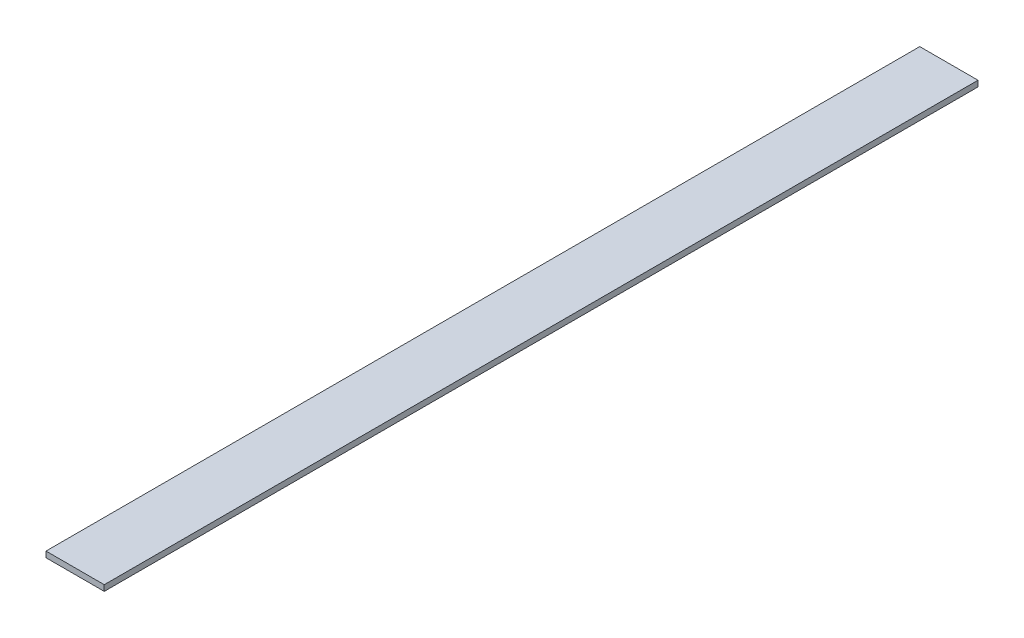
ISO-10303-21;
HEADER;
FILE_DESCRIPTION(('STEP AP214'),'2;1');
FILE_NAME('part.step','',(''),(''),'','','');
FILE_SCHEMA(('AUTOMOTIVE_DESIGN { 1 0 10303 214 1 1 1 1 }'));
ENDSEC;
DATA;
#1=APPLICATION_CONTEXT('core data for automotive mechanical design processes');
#2=APPLICATION_PROTOCOL_DEFINITION('international standard','automotive_design',2000,#1);
#3=PRODUCT_CONTEXT('',#1,'mechanical');
#4=PRODUCT('Part','Part','',(#3));
#5=PRODUCT_RELATED_PRODUCT_CATEGORY('part','',(#4));
#6=PRODUCT_DEFINITION_FORMATION('','',#4);
#7=PRODUCT_DEFINITION_CONTEXT('part definition',#1,'design');
#8=PRODUCT_DEFINITION('design','',#6,#7);
#9=PRODUCT_DEFINITION_SHAPE('','',#8);
#10=(LENGTH_UNIT() NAMED_UNIT(*) SI_UNIT(.MILLI.,.METRE.));
#11=(NAMED_UNIT(*) PLANE_ANGLE_UNIT() SI_UNIT($,.RADIAN.));
#12=(NAMED_UNIT(*) SI_UNIT($,.STERADIAN.) SOLID_ANGLE_UNIT());
#13=UNCERTAINTY_MEASURE_WITH_UNIT(LENGTH_MEASURE(1.E-05),#10,'distance_accuracy_value','');
#14=(GEOMETRIC_REPRESENTATION_CONTEXT(3) GLOBAL_UNCERTAINTY_ASSIGNED_CONTEXT((#13)) GLOBAL_UNIT_ASSIGNED_CONTEXT((#10,
#11,#12)) REPRESENTATION_CONTEXT('',''));
#15=CARTESIAN_POINT('',(0.,0.,0.));
#16=DIRECTION('',(0.,0.,1.));
#17=DIRECTION('',(1.,0.,0.));
#18=AXIS2_PLACEMENT_3D('',#15,#16,#17);
#19=CARTESIAN_POINT('',(-9.86567359338224,4.3353397151684,300.));
#20=DIRECTION('',(-1.,0.,0.));
#21=DIRECTION('',(0.,0.,1.));
#22=AXIS2_PLACEMENT_3D('',#19,#20,#21);
#23=PLANE('',#22);
#24=DIRECTION('',(0.,1.,0.));
#25=VECTOR('',#24,1.);
#26=CARTESIAN_POINT('',(-9.86567359338224,4.3353397151684,0.));
#27=LINE('',#26,#25);
#28=CARTESIAN_POINT('',(-9.86567359338224,2.3353397151684,0.));
#29=VERTEX_POINT('',#28);
#30=CARTESIAN_POINT('',(-9.86567359338224,4.3353397151684,0.));
#31=VERTEX_POINT('',#30);
#32=EDGE_CURVE('E96',#29,#31,#27,.T.);
#33=ORIENTED_EDGE('',*,*,#32,.T.);
#34=DIRECTION('',(0.,0.,-1.));
#35=VECTOR('',#34,1.);
#36=CARTESIAN_POINT('',(-9.86567359338224,4.3353397151684,300.));
#37=LINE('',#36,#35);
#38=CARTESIAN_POINT('',(-9.86567359338224,4.3353397151684,300.));
#39=VERTEX_POINT('',#38);
#40=EDGE_CURVE('E11',#39,#31,#37,.T.);
#41=ORIENTED_EDGE('',*,*,#40,.F.);
#42=DIRECTION('',(0.,1.,0.));
#43=VECTOR('',#42,1.);
#44=CARTESIAN_POINT('',(-9.86567359338224,4.3353397151684,300.));
#45=LINE('',#44,#43);
#46=CARTESIAN_POINT('',(-9.86567359338224,2.3353397151684,300.));
#47=VERTEX_POINT('',#46);
#48=EDGE_CURVE('E84',#47,#39,#45,.T.);
#49=ORIENTED_EDGE('',*,*,#48,.F.);
#50=DIRECTION('',(0.,0.,-1.));
#51=VECTOR('',#50,1.);
#52=CARTESIAN_POINT('',(-9.86567359338224,2.3353397151684,300.));
#53=LINE('',#52,#51);
#54=EDGE_CURVE('E92',#47,#29,#53,.T.);
#55=ORIENTED_EDGE('',*,*,#54,.T.);
#56=EDGE_LOOP('',(#33,#41,#49,#55));
#57=FACE_BOUND('',#56,.T.);
#58=ADVANCED_FACE('F33',(#57),#23,.F.);
#59=CARTESIAN_POINT('',(-29.8656735933822,4.3353397151684,300.));
#60=DIRECTION('',(0.,-1.,0.));
#61=DIRECTION('',(0.,0.,-1.));
#62=AXIS2_PLACEMENT_3D('',#59,#60,#61);
#63=PLANE('',#62);
#64=DIRECTION('',(-1.,0.,0.));
#65=VECTOR('',#64,1.);
#66=CARTESIAN_POINT('',(-29.8656735933822,4.3353397151684,0.));
#67=LINE('',#66,#65);
#68=CARTESIAN_POINT('',(-29.8656735933822,4.3353397151684,0.));
#69=VERTEX_POINT('',#68);
#70=EDGE_CURVE('E88',#31,#69,#67,.T.);
#71=ORIENTED_EDGE('',*,*,#70,.T.);
#72=DIRECTION('',(0.,0.,-1.));
#73=VECTOR('',#72,1.);
#74=CARTESIAN_POINT('',(-29.8656735933822,4.3353397151684,300.));
#75=LINE('',#74,#73);
#76=CARTESIAN_POINT('',(-29.8656735933822,4.3353397151684,300.));
#77=VERTEX_POINT('',#76);
#78=EDGE_CURVE('E41',#77,#69,#75,.T.);
#79=ORIENTED_EDGE('',*,*,#78,.F.);
#80=DIRECTION('',(-1.,0.,0.));
#81=VECTOR('',#80,1.);
#82=CARTESIAN_POINT('',(-29.8656735933822,4.3353397151684,300.));
#83=LINE('',#82,#81);
#84=EDGE_CURVE('E79',#39,#77,#83,.T.);
#85=ORIENTED_EDGE('',*,*,#84,.F.);
#86=ORIENTED_EDGE('',*,*,#40,.T.);
#87=EDGE_LOOP('',(#71,#79,#85,#86));
#88=FACE_BOUND('',#87,.T.);
#89=ADVANCED_FACE('F87',(#88),#63,.F.);
#90=CARTESIAN_POINT('',(-29.8656735933822,4.3353397151684,300.));
#91=DIRECTION('',(1.,0.,0.));
#92=DIRECTION('',(0.,0.,-1.));
#93=AXIS2_PLACEMENT_3D('',#90,#91,#92);
#94=PLANE('',#93);
#95=DIRECTION('',(0.,-1.,0.));
#96=VECTOR('',#95,1.);
#97=CARTESIAN_POINT('',(-29.8656735933822,4.3353397151684,0.));
#98=LINE('',#97,#96);
#99=CARTESIAN_POINT('',(-29.8656735933822,2.3353397151684,0.));
#100=VERTEX_POINT('',#99);
#101=EDGE_CURVE('E66',#69,#100,#98,.T.);
#102=ORIENTED_EDGE('',*,*,#101,.T.);
#103=DIRECTION('',(0.,0.,-1.));
#104=VECTOR('',#103,1.);
#105=CARTESIAN_POINT('',(-29.8656735933822,2.3353397151684,300.));
#106=LINE('',#105,#104);
#107=CARTESIAN_POINT('',(-29.8656735933822,2.3353397151684,300.));
#108=VERTEX_POINT('',#107);
#109=EDGE_CURVE('E89',#108,#100,#106,.T.);
#110=ORIENTED_EDGE('',*,*,#109,.F.);
#111=DIRECTION('',(0.,-1.,0.));
#112=VECTOR('',#111,1.);
#113=CARTESIAN_POINT('',(-29.8656735933822,4.3353397151684,300.));
#114=LINE('',#113,#112);
#115=EDGE_CURVE('E82',#77,#108,#114,.T.);
#116=ORIENTED_EDGE('',*,*,#115,.F.);
#117=ORIENTED_EDGE('',*,*,#78,.T.);
#118=EDGE_LOOP('',(#102,#110,#116,#117));
#119=FACE_BOUND('',#118,.T.);
#120=ADVANCED_FACE('F90',(#119),#94,.F.);
#121=CARTESIAN_POINT('',(-29.8656735933822,2.3353397151684,300.));
#122=DIRECTION('',(0.,1.,0.));
#123=DIRECTION('',(0.,0.,1.));
#124=AXIS2_PLACEMENT_3D('',#121,#122,#123);
#125=PLANE('',#124);
#126=DIRECTION('',(1.,0.,0.));
#127=VECTOR('',#126,1.);
#128=CARTESIAN_POINT('',(-29.8656735933822,2.3353397151684,0.));
#129=LINE('',#128,#127);
#130=EDGE_CURVE('E72',#100,#29,#129,.T.);
#131=ORIENTED_EDGE('',*,*,#130,.T.);
#132=ORIENTED_EDGE('',*,*,#54,.F.);
#133=DIRECTION('',(1.,0.,0.));
#134=VECTOR('',#133,1.);
#135=CARTESIAN_POINT('',(-29.8656735933822,2.3353397151684,300.));
#136=LINE('',#135,#134);
#137=EDGE_CURVE('E49',#108,#47,#136,.T.);
#138=ORIENTED_EDGE('',*,*,#137,.F.);
#139=ORIENTED_EDGE('',*,*,#109,.T.);
#140=EDGE_LOOP('',(#131,#132,#138,#139));
#141=FACE_BOUND('',#140,.T.);
#142=ADVANCED_FACE('F103',(#141),#125,.F.);
#143=CARTESIAN_POINT('',(0.,0.,300.));
#144=DIRECTION('',(0.,0.,1.));
#145=DIRECTION('',(1.,0.,0.));
#146=AXIS2_PLACEMENT_3D('',#143,#144,#145);
#147=PLANE('',#146);
#148=ORIENTED_EDGE('',*,*,#48,.T.);
#149=ORIENTED_EDGE('',*,*,#84,.T.);
#150=ORIENTED_EDGE('',*,*,#115,.T.);
#151=ORIENTED_EDGE('',*,*,#137,.T.);
#152=EDGE_LOOP('',(#148,#149,#150,#151));
#153=FACE_BOUND('',#152,.T.);
#154=ADVANCED_FACE('F80',(#153),#147,.T.);
#155=CARTESIAN_POINT('',(0.,0.,0.));
#156=DIRECTION('',(0.,0.,1.));
#157=DIRECTION('',(1.,0.,0.));
#158=AXIS2_PLACEMENT_3D('',#155,#156,#157);
#159=PLANE('',#158);
#160=ORIENTED_EDGE('',*,*,#32,.F.);
#161=ORIENTED_EDGE('',*,*,#130,.F.);
#162=ORIENTED_EDGE('',*,*,#101,.F.);
#163=ORIENTED_EDGE('',*,*,#70,.F.);
#164=EDGE_LOOP('',(#160,#161,#162,#163));
#165=FACE_BOUND('',#164,.T.);
#166=ADVANCED_FACE('F106',(#165),#159,.F.);
#167=CLOSED_SHELL('',(#58,#89,#120,#142,#154,#166));
#168=MANIFOLD_SOLID_BREP('B2',#167);
#169=ADVANCED_BREP_SHAPE_REPRESENTATION('',(#18,#168),#14);
#170=SHAPE_DEFINITION_REPRESENTATION(#9,#169);
ENDSEC;
END-ISO-10303-21;
